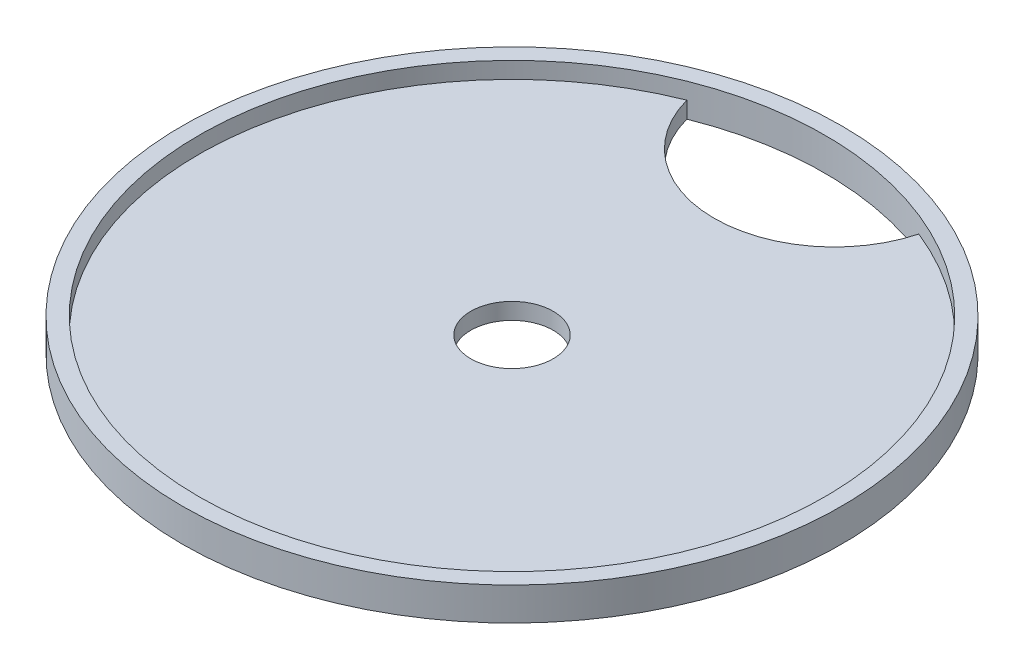
ISO-10303-21;
HEADER;
FILE_DESCRIPTION(('STEP AP214'),'2;1');
FILE_NAME('part.step','',(''),(''),'','','');
FILE_SCHEMA(('AUTOMOTIVE_DESIGN { 1 0 10303 214 1 1 1 1 }'));
ENDSEC;
DATA;
#1=APPLICATION_CONTEXT('core data for automotive mechanical design processes');
#2=APPLICATION_PROTOCOL_DEFINITION('international standard','automotive_design',2000,#1);
#3=PRODUCT_CONTEXT('',#1,'mechanical');
#4=PRODUCT('Part','Part','',(#3));
#5=PRODUCT_RELATED_PRODUCT_CATEGORY('part','',(#4));
#6=PRODUCT_DEFINITION_FORMATION('','',#4);
#7=PRODUCT_DEFINITION_CONTEXT('part definition',#1,'design');
#8=PRODUCT_DEFINITION('design','',#6,#7);
#9=PRODUCT_DEFINITION_SHAPE('','',#8);
#10=(LENGTH_UNIT() NAMED_UNIT(*) SI_UNIT(.MILLI.,.METRE.));
#11=(NAMED_UNIT(*) PLANE_ANGLE_UNIT() SI_UNIT($,.RADIAN.));
#12=(NAMED_UNIT(*) SI_UNIT($,.STERADIAN.) SOLID_ANGLE_UNIT());
#13=UNCERTAINTY_MEASURE_WITH_UNIT(LENGTH_MEASURE(1.E-05),#10,'distance_accuracy_value','');
#14=(GEOMETRIC_REPRESENTATION_CONTEXT(3) GLOBAL_UNCERTAINTY_ASSIGNED_CONTEXT((#13)) GLOBAL_UNIT_ASSIGNED_CONTEXT((#10,
#11,#12)) REPRESENTATION_CONTEXT('',''));
#15=CARTESIAN_POINT('',(0.,0.,0.));
#16=DIRECTION('',(0.,0.,1.));
#17=DIRECTION('',(1.,0.,0.));
#18=AXIS2_PLACEMENT_3D('',#15,#16,#17);
#19=CARTESIAN_POINT('',(0.,40.,0.));
#20=DIRECTION('',(0.,-1.,0.));
#21=DIRECTION('',(0.,0.,-1.));
#22=AXIS2_PLACEMENT_3D('',#19,#20,#21);
#23=CYLINDRICAL_SURFACE('',#22,40.);
#24=CARTESIAN_POINT('',(0.,0.,0.));
#25=DIRECTION('',(0.,1.,0.));
#26=DIRECTION('',(0.,0.,1.));
#27=AXIS2_PLACEMENT_3D('',#24,#25,#26);
#28=CIRCLE('',#27,40.);
#29=CARTESIAN_POINT('',(0.,0.,40.));
#30=VERTEX_POINT('',#29);
#31=EDGE_CURVE('E79',#30,#30,#28,.T.);
#32=ORIENTED_EDGE('',*,*,#31,.T.);
#33=EDGE_LOOP('',(#32));
#34=FACE_BOUND('',#33,.T.);
#35=CARTESIAN_POINT('',(0.,4.,0.));
#36=DIRECTION('',(0.,1.,0.));
#37=DIRECTION('',(0.,0.,1.));
#38=AXIS2_PLACEMENT_3D('',#35,#36,#37);
#39=CIRCLE('',#38,40.);
#40=CARTESIAN_POINT('',(0.,4.,40.));
#41=VERTEX_POINT('',#40);
#42=EDGE_CURVE('E107',#41,#41,#39,.T.);
#43=ORIENTED_EDGE('',*,*,#42,.F.);
#44=EDGE_LOOP('',(#43));
#45=FACE_BOUND('',#44,.T.);
#46=ADVANCED_FACE('F38',(#34,#45),#23,.T.);
#47=CARTESIAN_POINT('',(0.,2.,0.));
#48=DIRECTION('',(0.,1.,0.));
#49=DIRECTION('',(0.,0.,1.));
#50=AXIS2_PLACEMENT_3D('',#47,#48,#49);
#51=CYLINDRICAL_SURFACE('',#50,38.);
#52=CARTESIAN_POINT('',(0.,2.,0.));
#53=DIRECTION('',(0.,1.,0.));
#54=DIRECTION('',(0.,0.,1.));
#55=AXIS2_PLACEMENT_3D('',#52,#53,#54);
#56=CIRCLE('',#55,38.);
#57=CARTESIAN_POINT('',(-14.0760667026475,2.,-35.296803625578));
#58=VERTEX_POINT('',#57);
#59=CARTESIAN_POINT('',(14.0760667026475,2.,-35.296803625578));
#60=VERTEX_POINT('',#59);
#61=EDGE_CURVE('E68',#58,#60,#56,.T.);
#62=ORIENTED_EDGE('',*,*,#61,.F.);
#63=DIRECTION('',(0.,1.,0.));
#64=VECTOR('',#63,1.);
#65=CARTESIAN_POINT('',(-14.0760667026475,-36.,-35.296803625578));
#66=LINE('',#65,#64);
#67=CARTESIAN_POINT('',(-14.0760667026475,0.,-35.296803625578));
#68=VERTEX_POINT('',#67);
#69=EDGE_CURVE('E53',#68,#58,#66,.T.);
#70=ORIENTED_EDGE('',*,*,#69,.F.);
#71=CARTESIAN_POINT('',(0.,0.,4.02455846426619E-13));
#72=DIRECTION('',(0.,1.,0.));
#73=DIRECTION('',(0.,0.,1.));
#74=AXIS2_PLACEMENT_3D('',#71,#72,#73);
#75=CIRCLE('',#74,38.0000000000004);
#76=CARTESIAN_POINT('',(14.0760667026475,0.,-35.296803625578));
#77=VERTEX_POINT('',#76);
#78=EDGE_CURVE('E70',#77,#68,#75,.T.);
#79=ORIENTED_EDGE('',*,*,#78,.F.);
#80=DIRECTION('',(0.,1.,0.));
#81=VECTOR('',#80,1.);
#82=CARTESIAN_POINT('',(14.0760667026475,-36.,-35.296803625578));
#83=LINE('',#82,#81);
#84=EDGE_CURVE('E58',#77,#60,#83,.T.);
#85=ORIENTED_EDGE('',*,*,#84,.T.);
#86=EDGE_LOOP('',(#62,#70,#79,#85));
#87=FACE_BOUND('',#86,.T.);
#88=CARTESIAN_POINT('',(0.,4.,0.));
#89=DIRECTION('',(0.,1.,0.));
#90=DIRECTION('',(0.,0.,1.));
#91=AXIS2_PLACEMENT_3D('',#88,#89,#90);
#92=CIRCLE('',#91,38.);
#93=CARTESIAN_POINT('',(0.,4.,38.));
#94=VERTEX_POINT('',#93);
#95=EDGE_CURVE('E41',#94,#94,#92,.F.);
#96=ORIENTED_EDGE('',*,*,#95,.F.);
#97=EDGE_LOOP('',(#96));
#98=FACE_BOUND('',#97,.T.);
#99=ADVANCED_FACE('F65',(#87,#98),#51,.F.);
#100=CARTESIAN_POINT('',(0.,0.,0.));
#101=DIRECTION('',(0.,1.,0.));
#102=DIRECTION('',(0.,0.,1.));
#103=AXIS2_PLACEMENT_3D('',#100,#101,#102);
#104=PLANE('',#103);
#105=CARTESIAN_POINT('',(-20.,0.,0.));
#106=DIRECTION('',(0.,1.,0.));
#107=DIRECTION('',(0.,0.,1.));
#108=AXIS2_PLACEMENT_3D('',#105,#106,#107);
#109=CIRCLE('',#108,2.);
#110=CARTESIAN_POINT('',(-20.,0.,2.));
#111=VERTEX_POINT('',#110);
#112=EDGE_CURVE('E11',#111,#111,#109,.F.);
#113=ORIENTED_EDGE('',*,*,#112,.F.);
#114=EDGE_LOOP('',(#113));
#115=FACE_BOUND('',#114,.T.);
#116=CARTESIAN_POINT('',(20.,0.,0.));
#117=DIRECTION('',(0.,1.,0.));
#118=DIRECTION('',(0.,0.,1.));
#119=AXIS2_PLACEMENT_3D('',#116,#117,#118);
#120=CIRCLE('',#119,2.);
#121=CARTESIAN_POINT('',(20.,0.,2.));
#122=VERTEX_POINT('',#121);
#123=EDGE_CURVE('E46',#122,#122,#120,.F.);
#124=ORIENTED_EDGE('',*,*,#123,.F.);
#125=EDGE_LOOP('',(#124));
#126=FACE_BOUND('',#125,.T.);
#127=CARTESIAN_POINT('',(0.,0.,0.));
#128=DIRECTION('',(0.,1.,0.));
#129=DIRECTION('',(0.,0.,1.));
#130=AXIS2_PLACEMENT_3D('',#127,#128,#129);
#131=CIRCLE('',#130,5.);
#132=CARTESIAN_POINT('',(0.,0.,5.));
#133=VERTEX_POINT('',#132);
#134=EDGE_CURVE('E76',#133,#133,#131,.T.);
#135=ORIENTED_EDGE('',*,*,#134,.T.);
#136=EDGE_LOOP('',(#135));
#137=FACE_BOUND('',#136,.T.);
#138=CARTESIAN_POINT('',(0.,0.,-39.1212194390183));
#139=DIRECTION('',(0.,1.,0.));
#140=DIRECTION('',(0.,0.,1.));
#141=AXIS2_PLACEMENT_3D('',#138,#139,#140);
#142=CIRCLE('',#141,14.5863569862894);
#143=EDGE_CURVE('E82',#68,#77,#142,.T.);
#144=ORIENTED_EDGE('',*,*,#143,.T.);
#145=ORIENTED_EDGE('',*,*,#78,.T.);
#146=EDGE_LOOP('',(#144,#145));
#147=FACE_BOUND('',#146,.T.);
#148=ORIENTED_EDGE('',*,*,#31,.F.);
#149=EDGE_LOOP('',(#148));
#150=FACE_BOUND('',#149,.T.);
#151=ADVANCED_FACE('F93',(#115,#126,#137,#147,#150),#104,.F.);
#152=CARTESIAN_POINT('',(0.,2.,0.));
#153=DIRECTION('',(0.,1.,0.));
#154=DIRECTION('',(0.,0.,1.));
#155=AXIS2_PLACEMENT_3D('',#152,#153,#154);
#156=PLANE('',#155);
#157=CARTESIAN_POINT('',(0.,2.,0.));
#158=DIRECTION('',(0.,1.,0.));
#159=DIRECTION('',(0.,0.,1.));
#160=AXIS2_PLACEMENT_3D('',#157,#158,#159);
#161=CIRCLE('',#160,5.);
#162=CARTESIAN_POINT('',(0.,2.,5.));
#163=VERTEX_POINT('',#162);
#164=EDGE_CURVE('E117',#163,#163,#161,.T.);
#165=ORIENTED_EDGE('',*,*,#164,.F.);
#166=EDGE_LOOP('',(#165));
#167=FACE_BOUND('',#166,.T.);
#168=CARTESIAN_POINT('',(0.,2.,-39.1212194390183));
#169=DIRECTION('',(0.,1.,0.));
#170=DIRECTION('',(0.,0.,1.));
#171=AXIS2_PLACEMENT_3D('',#168,#169,#170);
#172=CIRCLE('',#171,14.5863569862894);
#173=EDGE_CURVE('E73',#58,#60,#172,.T.);
#174=ORIENTED_EDGE('',*,*,#173,.F.);
#175=ORIENTED_EDGE('',*,*,#61,.T.);
#176=EDGE_LOOP('',(#174,#175));
#177=FACE_BOUND('',#176,.T.);
#178=ADVANCED_FACE('F78',(#167,#177),#156,.T.);
#179=CARTESIAN_POINT('',(0.,-36.,-39.1212194390183));
#180=DIRECTION('',(0.,1.,0.));
#181=DIRECTION('',(0.,0.,1.));
#182=AXIS2_PLACEMENT_3D('',#179,#180,#181);
#183=CYLINDRICAL_SURFACE('',#182,14.5863569862894);
#184=ORIENTED_EDGE('',*,*,#69,.T.);
#185=ORIENTED_EDGE('',*,*,#173,.T.);
#186=ORIENTED_EDGE('',*,*,#84,.F.);
#187=ORIENTED_EDGE('',*,*,#143,.F.);
#188=EDGE_LOOP('',(#184,#185,#186,#187));
#189=FACE_BOUND('',#188,.T.);
#190=ADVANCED_FACE('F74',(#189),#183,.F.);
#191=CARTESIAN_POINT('',(0.,-36.,0.));
#192=DIRECTION('',(0.,1.,0.));
#193=DIRECTION('',(0.,0.,1.));
#194=AXIS2_PLACEMENT_3D('',#191,#192,#193);
#195=CYLINDRICAL_SURFACE('',#194,5.);
#196=ORIENTED_EDGE('',*,*,#164,.T.);
#197=EDGE_LOOP('',(#196));
#198=FACE_BOUND('',#197,.T.);
#199=ORIENTED_EDGE('',*,*,#134,.F.);
#200=EDGE_LOOP('',(#199));
#201=FACE_BOUND('',#200,.T.);
#202=ADVANCED_FACE('F123',(#198,#201),#195,.F.);
#203=CARTESIAN_POINT('',(20.,-2.,0.));
#204=DIRECTION('',(0.,1.,0.));
#205=DIRECTION('',(0.,0.,1.));
#206=AXIS2_PLACEMENT_3D('',#203,#204,#205);
#207=CYLINDRICAL_SURFACE('',#206,2.);
#208=CARTESIAN_POINT('',(20.,-2.,0.));
#209=DIRECTION('',(0.,-1.,0.));
#210=DIRECTION('',(0.,0.,-1.));
#211=AXIS2_PLACEMENT_3D('',#208,#209,#210);
#212=CIRCLE('',#211,2.);
#213=CARTESIAN_POINT('',(20.,-2.,-2.));
#214=VERTEX_POINT('',#213);
#215=EDGE_CURVE('E109',#214,#214,#212,.T.);
#216=ORIENTED_EDGE('',*,*,#215,.F.);
#217=EDGE_LOOP('',(#216));
#218=FACE_BOUND('',#217,.T.);
#219=ORIENTED_EDGE('',*,*,#123,.T.);
#220=EDGE_LOOP('',(#219));
#221=FACE_BOUND('',#220,.T.);
#222=ADVANCED_FACE('F91',(#218,#221),#207,.T.);
#223=CARTESIAN_POINT('',(20.,-2.,0.));
#224=DIRECTION('',(0.,-1.,0.));
#225=DIRECTION('',(0.,0.,-1.));
#226=AXIS2_PLACEMENT_3D('',#223,#224,#225);
#227=PLANE('',#226);
#228=ORIENTED_EDGE('',*,*,#215,.T.);
#229=EDGE_LOOP('',(#228));
#230=FACE_BOUND('',#229,.T.);
#231=ADVANCED_FACE('F178',(#230),#227,.T.);
#232=CARTESIAN_POINT('',(-20.,-2.,0.));
#233=DIRECTION('',(0.,1.,0.));
#234=DIRECTION('',(0.,0.,1.));
#235=AXIS2_PLACEMENT_3D('',#232,#233,#234);
#236=CYLINDRICAL_SURFACE('',#235,2.);
#237=CARTESIAN_POINT('',(-20.,-2.,0.));
#238=DIRECTION('',(0.,-1.,0.));
#239=DIRECTION('',(0.,0.,-1.));
#240=AXIS2_PLACEMENT_3D('',#237,#238,#239);
#241=CIRCLE('',#240,2.);
#242=CARTESIAN_POINT('',(-20.,-2.,-2.));
#243=VERTEX_POINT('',#242);
#244=EDGE_CURVE('E112',#243,#243,#241,.T.);
#245=ORIENTED_EDGE('',*,*,#244,.F.);
#246=EDGE_LOOP('',(#245));
#247=FACE_BOUND('',#246,.T.);
#248=ORIENTED_EDGE('',*,*,#112,.T.);
#249=EDGE_LOOP('',(#248));
#250=FACE_BOUND('',#249,.T.);
#251=ADVANCED_FACE('F168',(#247,#250),#236,.T.);
#252=CARTESIAN_POINT('',(-20.,-2.,0.));
#253=DIRECTION('',(0.,-1.,0.));
#254=DIRECTION('',(0.,0.,-1.));
#255=AXIS2_PLACEMENT_3D('',#252,#253,#254);
#256=PLANE('',#255);
#257=ORIENTED_EDGE('',*,*,#244,.T.);
#258=EDGE_LOOP('',(#257));
#259=FACE_BOUND('',#258,.T.);
#260=ADVANCED_FACE('F148',(#259),#256,.T.);
#261=CARTESIAN_POINT('',(0.,4.,0.));
#262=DIRECTION('',(0.,1.,0.));
#263=DIRECTION('',(0.,0.,1.));
#264=AXIS2_PLACEMENT_3D('',#261,#262,#263);
#265=PLANE('',#264);
#266=ORIENTED_EDGE('',*,*,#95,.T.);
#267=EDGE_LOOP('',(#266));
#268=FACE_BOUND('',#267,.T.);
#269=ORIENTED_EDGE('',*,*,#42,.T.);
#270=EDGE_LOOP('',(#269));
#271=FACE_BOUND('',#270,.T.);
#272=ADVANCED_FACE('F145',(#268,#271),#265,.T.);
#273=CLOSED_SHELL('',(#46,#99,#151,#178,#190,#202,#222,#231,#251,#260,#272));
#274=MANIFOLD_SOLID_BREP('B2',#273);
#275=ADVANCED_BREP_SHAPE_REPRESENTATION('',(#18,#274),#14);
#276=SHAPE_DEFINITION_REPRESENTATION(#9,#275);
ENDSEC;
END-ISO-10303-21;
